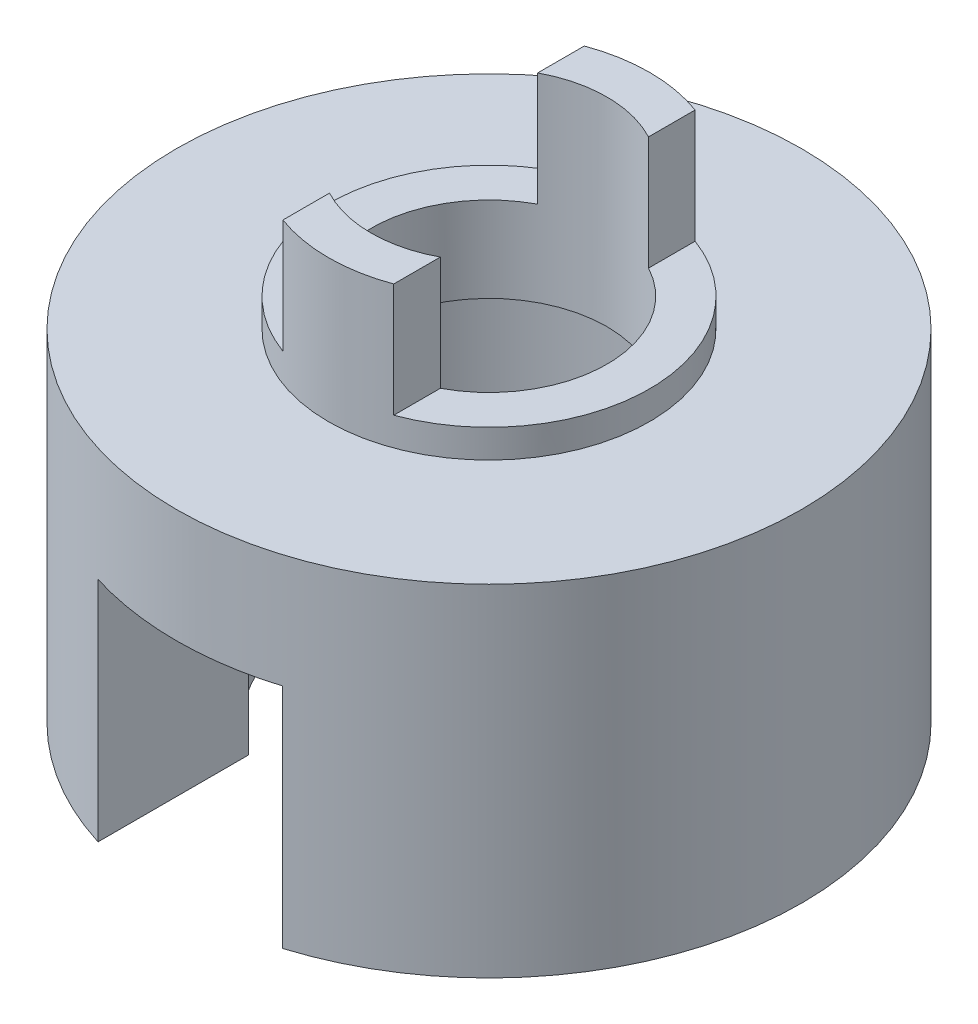
ISO-10303-21;
HEADER;
FILE_DESCRIPTION(('STEP AP214'),'2;1');
FILE_NAME('part.step','',(''),(''),'','','');
FILE_SCHEMA(('AUTOMOTIVE_DESIGN { 1 0 10303 214 1 1 1 1 }'));
ENDSEC;
DATA;
#1=APPLICATION_CONTEXT('core data for automotive mechanical design processes');
#2=APPLICATION_PROTOCOL_DEFINITION('international standard','automotive_design',2000,#1);
#3=PRODUCT_CONTEXT('',#1,'mechanical');
#4=PRODUCT('Part','Part','',(#3));
#5=PRODUCT_RELATED_PRODUCT_CATEGORY('part','',(#4));
#6=PRODUCT_DEFINITION_FORMATION('','',#4);
#7=PRODUCT_DEFINITION_CONTEXT('part definition',#1,'design');
#8=PRODUCT_DEFINITION('design','',#6,#7);
#9=PRODUCT_DEFINITION_SHAPE('','',#8);
#10=(LENGTH_UNIT() NAMED_UNIT(*) SI_UNIT(.MILLI.,.METRE.));
#11=(NAMED_UNIT(*) PLANE_ANGLE_UNIT() SI_UNIT($,.RADIAN.));
#12=(NAMED_UNIT(*) SI_UNIT($,.STERADIAN.) SOLID_ANGLE_UNIT());
#13=UNCERTAINTY_MEASURE_WITH_UNIT(LENGTH_MEASURE(1.E-05),#10,'distance_accuracy_value','');
#14=(GEOMETRIC_REPRESENTATION_CONTEXT(3) GLOBAL_UNCERTAINTY_ASSIGNED_CONTEXT((#13)) GLOBAL_UNIT_ASSIGNED_CONTEXT((#10,
#11,#12)) REPRESENTATION_CONTEXT('',''));
#15=CARTESIAN_POINT('',(0.,0.,0.));
#16=DIRECTION('',(0.,0.,1.));
#17=DIRECTION('',(1.,0.,0.));
#18=AXIS2_PLACEMENT_3D('',#15,#16,#17);
#19=CARTESIAN_POINT('',(0.,-2.,0.));
#20=DIRECTION('',(0.,1.,0.));
#21=DIRECTION('',(0.,0.,1.));
#22=AXIS2_PLACEMENT_3D('',#19,#20,#21);
#23=CYLINDRICAL_SURFACE('',#22,11.);
#24=CARTESIAN_POINT('',(0.,0.,0.));
#25=DIRECTION('',(0.,1.,0.));
#26=DIRECTION('',(0.,0.,1.));
#27=AXIS2_PLACEMENT_3D('',#24,#25,#26);
#28=CIRCLE('',#27,11.);
#29=CARTESIAN_POINT('',(0.,0.,11.));
#30=VERTEX_POINT('',#29);
#31=EDGE_CURVE('E60',#30,#30,#28,.T.);
#32=ORIENTED_EDGE('',*,*,#31,.F.);
#33=EDGE_LOOP('',(#32));
#34=FACE_BOUND('',#33,.T.);
#35=CARTESIAN_POINT('',(0.,-4.,0.));
#36=DIRECTION('',(0.,-1.,0.));
#37=DIRECTION('',(0.,0.,-1.));
#38=AXIS2_PLACEMENT_3D('',#35,#36,#37);
#39=CIRCLE('',#38,11.);
#40=CARTESIAN_POINT('',(3.25,-4.,10.5089247784919));
#41=VERTEX_POINT('',#40);
#42=CARTESIAN_POINT('',(-3.25,-4.,10.5089247784919));
#43=VERTEX_POINT('',#42);
#44=EDGE_CURVE('E180',#41,#43,#39,.T.);
#45=ORIENTED_EDGE('',*,*,#44,.F.);
#46=DIRECTION('',(0.,-1.,0.));
#47=VECTOR('',#46,1.);
#48=CARTESIAN_POINT('',(3.25,-4.,10.5089247784919));
#49=LINE('',#48,#47);
#50=CARTESIAN_POINT('',(3.25,-12.,10.5089247784919));
#51=VERTEX_POINT('',#50);
#52=EDGE_CURVE('E165',#41,#51,#49,.T.);
#53=ORIENTED_EDGE('',*,*,#52,.T.);
#54=CARTESIAN_POINT('',(0.,-12.,0.));
#55=DIRECTION('',(0.,-1.,0.));
#56=DIRECTION('',(0.,0.,-1.));
#57=AXIS2_PLACEMENT_3D('',#54,#55,#56);
#58=CIRCLE('',#57,11.);
#59=CARTESIAN_POINT('',(-10.7121426428143,-12.,-2.5));
#60=VERTEX_POINT('',#59);
#61=EDGE_CURVE('E247',#60,#51,#58,.T.);
#62=ORIENTED_EDGE('',*,*,#61,.F.);
#63=DIRECTION('',(0.,1.,0.));
#64=VECTOR('',#63,1.);
#65=CARTESIAN_POINT('',(-10.7121426428143,-2.,-2.5));
#66=LINE('',#65,#64);
#67=CARTESIAN_POINT('',(-10.7121426428143,-4.,-2.5));
#68=VERTEX_POINT('',#67);
#69=EDGE_CURVE('E231',#68,#60,#66,.F.);
#70=ORIENTED_EDGE('',*,*,#69,.F.);
#71=CARTESIAN_POINT('',(0.,-4.,0.));
#72=DIRECTION('',(0.,1.,0.));
#73=DIRECTION('',(0.,0.,1.));
#74=AXIS2_PLACEMENT_3D('',#71,#72,#73);
#75=CIRCLE('',#74,11.);
#76=CARTESIAN_POINT('',(-10.7121426428143,-4.,2.5));
#77=VERTEX_POINT('',#76);
#78=EDGE_CURVE('E204',#77,#68,#75,.F.);
#79=ORIENTED_EDGE('',*,*,#78,.F.);
#80=DIRECTION('',(0.,1.,0.));
#81=VECTOR('',#80,1.);
#82=CARTESIAN_POINT('',(-10.7121426428143,-2.,2.5));
#83=LINE('',#82,#81);
#84=CARTESIAN_POINT('',(-10.7121426428143,-12.,2.5));
#85=VERTEX_POINT('',#84);
#86=EDGE_CURVE('E234',#77,#85,#83,.F.);
#87=ORIENTED_EDGE('',*,*,#86,.T.);
#88=CARTESIAN_POINT('',(-3.25,-12.,10.5089247784919));
#89=VERTEX_POINT('',#88);
#90=EDGE_CURVE('E250',#89,#85,#58,.T.);
#91=ORIENTED_EDGE('',*,*,#90,.F.);
#92=DIRECTION('',(0.,-1.,0.));
#93=VECTOR('',#92,1.);
#94=CARTESIAN_POINT('',(-3.25,-4.,10.5089247784919));
#95=LINE('',#94,#93);
#96=EDGE_CURVE('E176',#43,#89,#95,.T.);
#97=ORIENTED_EDGE('',*,*,#96,.F.);
#98=EDGE_LOOP('',(#45,#53,#62,#70,#79,#87,#91,#97));
#99=FACE_BOUND('',#98,.T.);
#100=ADVANCED_FACE('F52',(#34,#99),#23,.T.);
#101=CARTESIAN_POINT('',(0.,-12.,0.));
#102=DIRECTION('',(0.,-1.,0.));
#103=DIRECTION('',(0.,0.,-1.));
#104=AXIS2_PLACEMENT_3D('',#101,#102,#103);
#105=PLANE('',#104);
#106=ORIENTED_EDGE('',*,*,#61,.T.);
#107=DIRECTION('',(0.,0.,-1.));
#108=VECTOR('',#107,1.);
#109=CARTESIAN_POINT('',(3.25,-12.,0.));
#110=LINE('',#109,#108);
#111=CARTESIAN_POINT('',(3.25,-12.,5.22111099288264));
#112=VERTEX_POINT('',#111);
#113=EDGE_CURVE('E170',#51,#112,#110,.T.);
#114=ORIENTED_EDGE('',*,*,#113,.T.);
#115=CARTESIAN_POINT('',(0.,-12.,0.));
#116=DIRECTION('',(0.,-1.,0.));
#117=DIRECTION('',(0.,0.,-1.));
#118=AXIS2_PLACEMENT_3D('',#115,#116,#117);
#119=CIRCLE('',#118,6.15);
#120=CARTESIAN_POINT('',(-5.61894118139708,-12.,-2.5));
#121=VERTEX_POINT('',#120);
#122=EDGE_CURVE('E239',#121,#112,#119,.T.);
#123=ORIENTED_EDGE('',*,*,#122,.F.);
#124=DIRECTION('',(1.,0.,0.));
#125=VECTOR('',#124,1.);
#126=CARTESIAN_POINT('',(-11.1812419844062,-12.,-2.5));
#127=LINE('',#126,#125);
#128=EDGE_CURVE('E217',#60,#121,#127,.T.);
#129=ORIENTED_EDGE('',*,*,#128,.F.);
#130=EDGE_LOOP('',(#106,#114,#123,#129));
#131=FACE_BOUND('',#130,.T.);
#132=ADVANCED_FACE('F345',(#131),#105,.T.);
#133=CARTESIAN_POINT('',(-3.25,-12.,5.22111099288264));
#134=VERTEX_POINT('',#133);
#135=CARTESIAN_POINT('',(-5.61894118139708,-12.,2.5));
#136=VERTEX_POINT('',#135);
#137=EDGE_CURVE('E243',#134,#136,#119,.T.);
#138=ORIENTED_EDGE('',*,*,#137,.F.);
#139=DIRECTION('',(0.,0.,1.));
#140=VECTOR('',#139,1.);
#141=CARTESIAN_POINT('',(-3.25,-12.,0.));
#142=LINE('',#141,#140);
#143=EDGE_CURVE('E185',#134,#89,#142,.T.);
#144=ORIENTED_EDGE('',*,*,#143,.T.);
#145=ORIENTED_EDGE('',*,*,#90,.T.);
#146=DIRECTION('',(1.,0.,0.));
#147=VECTOR('',#146,1.);
#148=CARTESIAN_POINT('',(-11.1812419844062,-12.,2.5));
#149=LINE('',#148,#147);
#150=EDGE_CURVE('E197',#85,#136,#149,.T.);
#151=ORIENTED_EDGE('',*,*,#150,.T.);
#152=EDGE_LOOP('',(#138,#144,#145,#151));
#153=FACE_BOUND('',#152,.T.);
#154=ADVANCED_FACE('F350',(#153),#105,.T.);
#155=CARTESIAN_POINT('',(0.,-12.,0.));
#156=DIRECTION('',(0.,1.,0.));
#157=DIRECTION('',(0.,0.,1.));
#158=AXIS2_PLACEMENT_3D('',#155,#156,#157);
#159=CYLINDRICAL_SURFACE('',#158,6.15);
#160=CARTESIAN_POINT('',(0.,-2.,0.));
#161=DIRECTION('',(0.,-1.,0.));
#162=DIRECTION('',(0.,0.,-1.));
#163=AXIS2_PLACEMENT_3D('',#160,#161,#162);
#164=CIRCLE('',#163,6.15);
#165=CARTESIAN_POINT('',(0.,-2.,-6.15));
#166=VERTEX_POINT('',#165);
#167=EDGE_CURVE('E238',#166,#166,#164,.T.);
#168=ORIENTED_EDGE('',*,*,#167,.F.);
#169=EDGE_LOOP('',(#168));
#170=FACE_BOUND('',#169,.T.);
#171=ORIENTED_EDGE('',*,*,#122,.T.);
#172=DIRECTION('',(0.,-1.,0.));
#173=VECTOR('',#172,1.);
#174=CARTESIAN_POINT('',(3.25,-4.,5.22111099288264));
#175=LINE('',#174,#173);
#176=CARTESIAN_POINT('',(3.25,-4.,5.22111099288264));
#177=VERTEX_POINT('',#176);
#178=EDGE_CURVE('E201',#177,#112,#175,.T.);
#179=ORIENTED_EDGE('',*,*,#178,.F.);
#180=CARTESIAN_POINT('',(0.,-4.,0.));
#181=DIRECTION('',(0.,-1.,0.));
#182=DIRECTION('',(0.,0.,-1.));
#183=AXIS2_PLACEMENT_3D('',#180,#181,#182);
#184=CIRCLE('',#183,6.15);
#185=CARTESIAN_POINT('',(-3.25,-4.,5.22111099288264));
#186=VERTEX_POINT('',#185);
#187=EDGE_CURVE('E177',#186,#177,#184,.F.);
#188=ORIENTED_EDGE('',*,*,#187,.F.);
#189=DIRECTION('',(0.,-1.,0.));
#190=VECTOR('',#189,1.);
#191=CARTESIAN_POINT('',(-3.25,-4.,5.22111099288264));
#192=LINE('',#191,#190);
#193=EDGE_CURVE('E205',#186,#134,#192,.T.);
#194=ORIENTED_EDGE('',*,*,#193,.T.);
#195=ORIENTED_EDGE('',*,*,#137,.T.);
#196=DIRECTION('',(0.,-1.,0.));
#197=VECTOR('',#196,1.);
#198=CARTESIAN_POINT('',(-5.61894118139708,-4.,2.5));
#199=LINE('',#198,#197);
#200=CARTESIAN_POINT('',(-5.61894118139708,-4.,2.5));
#201=VERTEX_POINT('',#200);
#202=EDGE_CURVE('E211',#201,#136,#199,.T.);
#203=ORIENTED_EDGE('',*,*,#202,.F.);
#204=CARTESIAN_POINT('',(0.,-4.,0.));
#205=DIRECTION('',(0.,1.,0.));
#206=DIRECTION('',(0.,0.,1.));
#207=AXIS2_PLACEMENT_3D('',#204,#205,#206);
#208=CIRCLE('',#207,6.15);
#209=CARTESIAN_POINT('',(-5.61894118139708,-4.,-2.5));
#210=VERTEX_POINT('',#209);
#211=EDGE_CURVE('E12',#210,#201,#208,.T.);
#212=ORIENTED_EDGE('',*,*,#211,.F.);
#213=DIRECTION('',(0.,-1.,0.));
#214=VECTOR('',#213,1.);
#215=CARTESIAN_POINT('',(-5.61894118139708,-4.,-2.5));
#216=LINE('',#215,#214);
#217=EDGE_CURVE('E75',#210,#121,#216,.T.);
#218=ORIENTED_EDGE('',*,*,#217,.T.);
#219=EDGE_LOOP('',(#171,#179,#188,#194,#195,#203,#212,#218));
#220=FACE_BOUND('',#219,.T.);
#221=ADVANCED_FACE('F356',(#170,#220),#159,.F.);
#222=CARTESIAN_POINT('',(0.,-2.,0.));
#223=DIRECTION('',(0.,1.,0.));
#224=DIRECTION('',(0.,0.,1.));
#225=AXIS2_PLACEMENT_3D('',#222,#223,#224);
#226=PLANE('',#225);
#227=CARTESIAN_POINT('',(0.,-2.,0.));
#228=DIRECTION('',(0.,1.,0.));
#229=DIRECTION('',(0.,0.,1.));
#230=AXIS2_PLACEMENT_3D('',#227,#228,#229);
#231=CIRCLE('',#230,4.15);
#232=CARTESIAN_POINT('',(0.,-2.,4.15));
#233=VERTEX_POINT('',#232);
#234=EDGE_CURVE('E335',#233,#233,#231,.T.);
#235=ORIENTED_EDGE('',*,*,#234,.T.);
#236=EDGE_LOOP('',(#235));
#237=FACE_BOUND('',#236,.T.);
#238=ORIENTED_EDGE('',*,*,#167,.T.);
#239=EDGE_LOOP('',(#238));
#240=FACE_BOUND('',#239,.T.);
#241=ADVANCED_FACE('F399',(#237,#240),#226,.F.);
#242=CARTESIAN_POINT('',(0.,5.,0.));
#243=DIRECTION('',(0.,1.,0.));
#244=DIRECTION('',(0.,0.,1.));
#245=AXIS2_PLACEMENT_3D('',#242,#243,#244);
#246=PLANE('',#245);
#247=DIRECTION('',(0.,0.,1.));
#248=VECTOR('',#247,1.);
#249=CARTESIAN_POINT('',(1.95,5.,3.66333181680284));
#250=LINE('',#249,#248);
#251=CARTESIAN_POINT('',(1.95,5.,3.66333181680284));
#252=VERTEX_POINT('',#251);
#253=CARTESIAN_POINT('',(1.95,5.,5.30282943342514));
#254=VERTEX_POINT('',#253);
#255=EDGE_CURVE('E256',#252,#254,#250,.T.);
#256=ORIENTED_EDGE('',*,*,#255,.F.);
#257=CARTESIAN_POINT('',(0.,5.,0.));
#258=DIRECTION('',(0.,1.,0.));
#259=DIRECTION('',(0.,0.,1.));
#260=AXIS2_PLACEMENT_3D('',#257,#258,#259);
#261=CIRCLE('',#260,4.15);
#262=CARTESIAN_POINT('',(-1.95,5.,3.66333181680284));
#263=VERTEX_POINT('',#262);
#264=EDGE_CURVE('E322',#263,#252,#261,.T.);
#265=ORIENTED_EDGE('',*,*,#264,.F.);
#266=DIRECTION('',(0.,0.,-1.));
#267=VECTOR('',#266,1.);
#268=CARTESIAN_POINT('',(-1.95,5.,3.66333181680284));
#269=LINE('',#268,#267);
#270=CARTESIAN_POINT('',(-1.95,5.,5.30282943342514));
#271=VERTEX_POINT('',#270);
#272=EDGE_CURVE('E305',#271,#263,#269,.T.);
#273=ORIENTED_EDGE('',*,*,#272,.F.);
#274=CARTESIAN_POINT('',(0.,5.,0.));
#275=DIRECTION('',(0.,1.,0.));
#276=DIRECTION('',(0.,0.,1.));
#277=AXIS2_PLACEMENT_3D('',#274,#275,#276);
#278=CIRCLE('',#277,5.65);
#279=EDGE_CURVE('E327',#271,#254,#278,.T.);
#280=ORIENTED_EDGE('',*,*,#279,.T.);
#281=EDGE_LOOP('',(#256,#265,#273,#280));
#282=FACE_BOUND('',#281,.T.);
#283=ADVANCED_FACE('F391',(#282),#246,.T.);
#284=CARTESIAN_POINT('',(0.,0.,0.));
#285=DIRECTION('',(0.,1.,0.));
#286=DIRECTION('',(0.,0.,1.));
#287=AXIS2_PLACEMENT_3D('',#284,#285,#286);
#288=PLANE('',#287);
#289=CARTESIAN_POINT('',(0.,0.,0.));
#290=DIRECTION('',(0.,1.,0.));
#291=DIRECTION('',(0.,0.,1.));
#292=AXIS2_PLACEMENT_3D('',#289,#290,#291);
#293=CIRCLE('',#292,5.65);
#294=CARTESIAN_POINT('',(0.,0.,5.65));
#295=VERTEX_POINT('',#294);
#296=EDGE_CURVE('E278',#295,#295,#293,.T.);
#297=ORIENTED_EDGE('',*,*,#296,.F.);
#298=EDGE_LOOP('',(#297));
#299=FACE_BOUND('',#298,.T.);
#300=ORIENTED_EDGE('',*,*,#31,.T.);
#301=EDGE_LOOP('',(#300));
#302=FACE_BOUND('',#301,.T.);
#303=ADVANCED_FACE('F342',(#299,#302),#288,.T.);
#304=CARTESIAN_POINT('',(0.,-2.,0.));
#305=DIRECTION('',(0.,1.,0.));
#306=DIRECTION('',(0.,0.,1.));
#307=AXIS2_PLACEMENT_3D('',#304,#305,#306);
#308=CYLINDRICAL_SURFACE('',#307,4.15);
#309=ORIENTED_EDGE('',*,*,#264,.T.);
#310=DIRECTION('',(0.,1.,0.));
#311=VECTOR('',#310,1.);
#312=CARTESIAN_POINT('',(1.95,1.,3.66333181680284));
#313=LINE('',#312,#311);
#314=CARTESIAN_POINT('',(1.95,1.,3.66333181680284));
#315=VERTEX_POINT('',#314);
#316=EDGE_CURVE('E279',#315,#252,#313,.T.);
#317=ORIENTED_EDGE('',*,*,#316,.F.);
#318=CARTESIAN_POINT('',(0.,1.,0.));
#319=DIRECTION('',(0.,-1.,0.));
#320=DIRECTION('',(0.,0.,1.));
#321=AXIS2_PLACEMENT_3D('',#318,#319,#320);
#322=CIRCLE('',#321,4.15);
#323=CARTESIAN_POINT('',(1.95,1.,-3.66333181680284));
#324=VERTEX_POINT('',#323);
#325=EDGE_CURVE('E260',#324,#315,#322,.T.);
#326=ORIENTED_EDGE('',*,*,#325,.F.);
#327=DIRECTION('',(0.,1.,0.));
#328=VECTOR('',#327,1.);
#329=CARTESIAN_POINT('',(1.95,1.,-3.66333181680284));
#330=LINE('',#329,#328);
#331=CARTESIAN_POINT('',(1.95,5.,-3.66333181680284));
#332=VERTEX_POINT('',#331);
#333=EDGE_CURVE('E282',#324,#332,#330,.T.);
#334=ORIENTED_EDGE('',*,*,#333,.T.);
#335=CARTESIAN_POINT('',(-1.95,5.,-3.66333181680284));
#336=VERTEX_POINT('',#335);
#337=EDGE_CURVE('E326',#332,#336,#261,.T.);
#338=ORIENTED_EDGE('',*,*,#337,.T.);
#339=DIRECTION('',(0.,1.,0.));
#340=VECTOR('',#339,1.);
#341=CARTESIAN_POINT('',(-1.95,1.,-3.66333181680284));
#342=LINE('',#341,#340);
#343=CARTESIAN_POINT('',(-1.95,1.,-3.66333181680284));
#344=VERTEX_POINT('',#343);
#345=EDGE_CURVE('E313',#344,#336,#342,.T.);
#346=ORIENTED_EDGE('',*,*,#345,.F.);
#347=CARTESIAN_POINT('',(0.,1.,0.));
#348=DIRECTION('',(0.,-1.,0.));
#349=DIRECTION('',(0.,0.,1.));
#350=AXIS2_PLACEMENT_3D('',#347,#348,#349);
#351=CIRCLE('',#350,4.15);
#352=CARTESIAN_POINT('',(-1.95,1.,3.66333181680284));
#353=VERTEX_POINT('',#352);
#354=EDGE_CURVE('E297',#353,#344,#351,.T.);
#355=ORIENTED_EDGE('',*,*,#354,.F.);
#356=DIRECTION('',(0.,1.,0.));
#357=VECTOR('',#356,1.);
#358=CARTESIAN_POINT('',(-1.95,1.,3.66333181680284));
#359=LINE('',#358,#357);
#360=EDGE_CURVE('E316',#353,#263,#359,.T.);
#361=ORIENTED_EDGE('',*,*,#360,.T.);
#362=EDGE_LOOP('',(#309,#317,#326,#334,#338,#346,#355,#361));
#363=FACE_BOUND('',#362,.T.);
#364=ORIENTED_EDGE('',*,*,#234,.F.);
#365=EDGE_LOOP('',(#364));
#366=FACE_BOUND('',#365,.T.);
#367=ADVANCED_FACE('F394',(#363,#366),#308,.F.);
#368=CARTESIAN_POINT('',(0.,5.,0.));
#369=DIRECTION('',(0.,-1.,0.));
#370=DIRECTION('',(0.,0.,-1.));
#371=AXIS2_PLACEMENT_3D('',#368,#369,#370);
#372=CYLINDRICAL_SURFACE('',#371,5.65);
#373=CARTESIAN_POINT('',(0.,1.,0.));
#374=DIRECTION('',(0.,1.,0.));
#375=DIRECTION('',(0.,0.,1.));
#376=AXIS2_PLACEMENT_3D('',#373,#374,#375);
#377=CIRCLE('',#376,5.65);
#378=CARTESIAN_POINT('',(1.95,1.,5.30282943342514));
#379=VERTEX_POINT('',#378);
#380=CARTESIAN_POINT('',(1.95,1.,-5.30282943342514));
#381=VERTEX_POINT('',#380);
#382=EDGE_CURVE('E251',#379,#381,#377,.T.);
#383=ORIENTED_EDGE('',*,*,#382,.F.);
#384=DIRECTION('',(0.,1.,0.));
#385=VECTOR('',#384,1.);
#386=CARTESIAN_POINT('',(1.95,1.,5.30282943342514));
#387=LINE('',#386,#385);
#388=EDGE_CURVE('E274',#379,#254,#387,.T.);
#389=ORIENTED_EDGE('',*,*,#388,.T.);
#390=ORIENTED_EDGE('',*,*,#279,.F.);
#391=DIRECTION('',(0.,1.,0.));
#392=VECTOR('',#391,1.);
#393=CARTESIAN_POINT('',(-1.95,1.,5.30282943342514));
#394=LINE('',#393,#392);
#395=CARTESIAN_POINT('',(-1.95,1.,5.30282943342514));
#396=VERTEX_POINT('',#395);
#397=EDGE_CURVE('E304',#396,#271,#394,.T.);
#398=ORIENTED_EDGE('',*,*,#397,.F.);
#399=CARTESIAN_POINT('',(0.,1.,0.));
#400=DIRECTION('',(0.,1.,0.));
#401=DIRECTION('',(0.,0.,1.));
#402=AXIS2_PLACEMENT_3D('',#399,#400,#401);
#403=CIRCLE('',#402,5.65);
#404=CARTESIAN_POINT('',(-1.95,1.,-5.30282943342514));
#405=VERTEX_POINT('',#404);
#406=EDGE_CURVE('E288',#405,#396,#403,.T.);
#407=ORIENTED_EDGE('',*,*,#406,.F.);
#408=DIRECTION('',(0.,1.,0.));
#409=VECTOR('',#408,1.);
#410=CARTESIAN_POINT('',(-1.95,1.,-5.30282943342514));
#411=LINE('',#410,#409);
#412=CARTESIAN_POINT('',(-1.95,5.,-5.30282943342514));
#413=VERTEX_POINT('',#412);
#414=EDGE_CURVE('E271',#405,#413,#411,.T.);
#415=ORIENTED_EDGE('',*,*,#414,.T.);
#416=CARTESIAN_POINT('',(1.95,5.,-5.30282943342514));
#417=VERTEX_POINT('',#416);
#418=EDGE_CURVE('E331',#417,#413,#278,.T.);
#419=ORIENTED_EDGE('',*,*,#418,.F.);
#420=DIRECTION('',(0.,1.,0.));
#421=VECTOR('',#420,1.);
#422=CARTESIAN_POINT('',(1.95,1.,-5.30282943342514));
#423=LINE('',#422,#421);
#424=EDGE_CURVE('E267',#381,#417,#423,.T.);
#425=ORIENTED_EDGE('',*,*,#424,.F.);
#426=EDGE_LOOP('',(#383,#389,#390,#398,#407,#415,#419,#425));
#427=FACE_BOUND('',#426,.T.);
#428=ORIENTED_EDGE('',*,*,#296,.T.);
#429=EDGE_LOOP('',(#428));
#430=FACE_BOUND('',#429,.T.);
#431=ADVANCED_FACE('F389',(#427,#430),#372,.T.);
#432=DIRECTION('',(0.,0.,1.));
#433=VECTOR('',#432,1.);
#434=CARTESIAN_POINT('',(1.95,5.,-5.30282943342514));
#435=LINE('',#434,#433);
#436=EDGE_CURVE('E268',#417,#332,#435,.T.);
#437=ORIENTED_EDGE('',*,*,#436,.F.);
#438=ORIENTED_EDGE('',*,*,#418,.T.);
#439=DIRECTION('',(0.,0.,-1.));
#440=VECTOR('',#439,1.);
#441=CARTESIAN_POINT('',(-1.95,5.,-5.30282943342514));
#442=LINE('',#441,#440);
#443=EDGE_CURVE('E293',#336,#413,#442,.T.);
#444=ORIENTED_EDGE('',*,*,#443,.F.);
#445=ORIENTED_EDGE('',*,*,#337,.F.);
#446=EDGE_LOOP('',(#437,#438,#444,#445));
#447=FACE_BOUND('',#446,.T.);
#448=ADVANCED_FACE('F382',(#447),#246,.T.);
#449=CARTESIAN_POINT('',(-1.95,1.,-5.30282943342514));
#450=DIRECTION('',(1.,0.,0.));
#451=DIRECTION('',(0.,0.,-1.));
#452=AXIS2_PLACEMENT_3D('',#449,#450,#451);
#453=PLANE('',#452);
#454=ORIENTED_EDGE('',*,*,#443,.T.);
#455=ORIENTED_EDGE('',*,*,#414,.F.);
#456=DIRECTION('',(0.,0.,-1.));
#457=VECTOR('',#456,1.);
#458=CARTESIAN_POINT('',(-1.95,1.,-5.30282943342514));
#459=LINE('',#458,#457);
#460=EDGE_CURVE('E300',#344,#405,#459,.T.);
#461=ORIENTED_EDGE('',*,*,#460,.F.);
#462=ORIENTED_EDGE('',*,*,#345,.T.);
#463=EDGE_LOOP('',(#454,#455,#461,#462));
#464=FACE_BOUND('',#463,.T.);
#465=ADVANCED_FACE('F379',(#464),#453,.F.);
#466=CARTESIAN_POINT('',(-1.95,1.,3.66333181680284));
#467=DIRECTION('',(1.,0.,0.));
#468=DIRECTION('',(0.,0.,-1.));
#469=AXIS2_PLACEMENT_3D('',#466,#467,#468);
#470=PLANE('',#469);
#471=ORIENTED_EDGE('',*,*,#272,.T.);
#472=ORIENTED_EDGE('',*,*,#360,.F.);
#473=DIRECTION('',(0.,0.,-1.));
#474=VECTOR('',#473,1.);
#475=CARTESIAN_POINT('',(-1.95,1.,3.66333181680284));
#476=LINE('',#475,#474);
#477=EDGE_CURVE('E292',#396,#353,#476,.T.);
#478=ORIENTED_EDGE('',*,*,#477,.F.);
#479=ORIENTED_EDGE('',*,*,#397,.T.);
#480=EDGE_LOOP('',(#471,#472,#478,#479));
#481=FACE_BOUND('',#480,.T.);
#482=ADVANCED_FACE('F377',(#481),#470,.F.);
#483=CARTESIAN_POINT('',(0.,1.,0.));
#484=DIRECTION('',(0.,1.,0.));
#485=DIRECTION('',(0.,0.,1.));
#486=AXIS2_PLACEMENT_3D('',#483,#484,#485);
#487=PLANE('',#486);
#488=ORIENTED_EDGE('',*,*,#406,.T.);
#489=ORIENTED_EDGE('',*,*,#477,.T.);
#490=ORIENTED_EDGE('',*,*,#354,.T.);
#491=ORIENTED_EDGE('',*,*,#460,.T.);
#492=EDGE_LOOP('',(#488,#489,#490,#491));
#493=FACE_BOUND('',#492,.T.);
#494=ADVANCED_FACE('F370',(#493),#487,.T.);
#495=CARTESIAN_POINT('',(1.95,1.,3.66333181680284));
#496=DIRECTION('',(-1.,0.,0.));
#497=DIRECTION('',(0.,0.,1.));
#498=AXIS2_PLACEMENT_3D('',#495,#496,#497);
#499=PLANE('',#498);
#500=ORIENTED_EDGE('',*,*,#255,.T.);
#501=ORIENTED_EDGE('',*,*,#388,.F.);
#502=DIRECTION('',(0.,0.,1.));
#503=VECTOR('',#502,1.);
#504=CARTESIAN_POINT('',(1.95,1.,3.66333181680284));
#505=LINE('',#504,#503);
#506=EDGE_CURVE('E263',#315,#379,#505,.T.);
#507=ORIENTED_EDGE('',*,*,#506,.F.);
#508=ORIENTED_EDGE('',*,*,#316,.T.);
#509=EDGE_LOOP('',(#500,#501,#507,#508));
#510=FACE_BOUND('',#509,.T.);
#511=ADVANCED_FACE('F367',(#510),#499,.F.);
#512=CARTESIAN_POINT('',(1.95,1.,-5.30282943342514));
#513=DIRECTION('',(-1.,0.,0.));
#514=DIRECTION('',(0.,0.,1.));
#515=AXIS2_PLACEMENT_3D('',#512,#513,#514);
#516=PLANE('',#515);
#517=ORIENTED_EDGE('',*,*,#436,.T.);
#518=ORIENTED_EDGE('',*,*,#333,.F.);
#519=DIRECTION('',(0.,0.,1.));
#520=VECTOR('',#519,1.);
#521=CARTESIAN_POINT('',(1.95,1.,-5.30282943342514));
#522=LINE('',#521,#520);
#523=EDGE_CURVE('E255',#381,#324,#522,.T.);
#524=ORIENTED_EDGE('',*,*,#523,.F.);
#525=ORIENTED_EDGE('',*,*,#424,.T.);
#526=EDGE_LOOP('',(#517,#518,#524,#525));
#527=FACE_BOUND('',#526,.T.);
#528=ADVANCED_FACE('F365',(#527),#516,.F.);
#529=CARTESIAN_POINT('',(0.,1.,0.));
#530=DIRECTION('',(0.,1.,0.));
#531=DIRECTION('',(0.,0.,1.));
#532=AXIS2_PLACEMENT_3D('',#529,#530,#531);
#533=PLANE('',#532);
#534=ORIENTED_EDGE('',*,*,#382,.T.);
#535=ORIENTED_EDGE('',*,*,#523,.T.);
#536=ORIENTED_EDGE('',*,*,#325,.T.);
#537=ORIENTED_EDGE('',*,*,#506,.T.);
#538=EDGE_LOOP('',(#534,#535,#536,#537));
#539=FACE_BOUND('',#538,.T.);
#540=ADVANCED_FACE('F361',(#539),#533,.T.);
#541=CARTESIAN_POINT('',(-11.1812419844062,-4.,2.5));
#542=DIRECTION('',(0.,0.,-1.));
#543=DIRECTION('',(-1.,0.,0.));
#544=AXIS2_PLACEMENT_3D('',#541,#542,#543);
#545=PLANE('',#544);
#546=DIRECTION('',(1.,0.,0.));
#547=VECTOR('',#546,1.);
#548=CARTESIAN_POINT('',(-11.1812419844062,-4.,2.5));
#549=LINE('',#548,#547);
#550=EDGE_CURVE('E220',#77,#201,#549,.T.);
#551=ORIENTED_EDGE('',*,*,#550,.T.);
#552=ORIENTED_EDGE('',*,*,#202,.T.);
#553=ORIENTED_EDGE('',*,*,#150,.F.);
#554=ORIENTED_EDGE('',*,*,#86,.F.);
#555=EDGE_LOOP('',(#551,#552,#553,#554));
#556=FACE_BOUND('',#555,.T.);
#557=ADVANCED_FACE('F364',(#556),#545,.T.);
#558=CARTESIAN_POINT('',(-11.1812419844062,-4.,-2.5));
#559=DIRECTION('',(0.,0.,-1.));
#560=DIRECTION('',(-1.,0.,0.));
#561=AXIS2_PLACEMENT_3D('',#558,#559,#560);
#562=PLANE('',#561);
#563=ORIENTED_EDGE('',*,*,#69,.T.);
#564=ORIENTED_EDGE('',*,*,#128,.T.);
#565=ORIENTED_EDGE('',*,*,#217,.F.);
#566=DIRECTION('',(1.,0.,0.));
#567=VECTOR('',#566,1.);
#568=CARTESIAN_POINT('',(-11.1812419844062,-4.,-2.5));
#569=LINE('',#568,#567);
#570=EDGE_CURVE('E216',#68,#210,#569,.T.);
#571=ORIENTED_EDGE('',*,*,#570,.F.);
#572=EDGE_LOOP('',(#563,#564,#565,#571));
#573=FACE_BOUND('',#572,.T.);
#574=ADVANCED_FACE('F449',(#573),#562,.F.);
#575=CARTESIAN_POINT('',(0.,-4.,0.));
#576=DIRECTION('',(0.,1.,0.));
#577=DIRECTION('',(0.,0.,1.));
#578=AXIS2_PLACEMENT_3D('',#575,#576,#577);
#579=PLANE('',#578);
#580=ORIENTED_EDGE('',*,*,#78,.T.);
#581=ORIENTED_EDGE('',*,*,#570,.T.);
#582=ORIENTED_EDGE('',*,*,#211,.T.);
#583=ORIENTED_EDGE('',*,*,#550,.F.);
#584=EDGE_LOOP('',(#580,#581,#582,#583));
#585=FACE_BOUND('',#584,.T.);
#586=ADVANCED_FACE('F448',(#585),#579,.F.);
#587=CARTESIAN_POINT('',(3.25,-4.,0.));
#588=DIRECTION('',(-1.,0.,0.));
#589=DIRECTION('',(0.,0.,1.));
#590=AXIS2_PLACEMENT_3D('',#587,#588,#589);
#591=PLANE('',#590);
#592=ORIENTED_EDGE('',*,*,#113,.F.);
#593=ORIENTED_EDGE('',*,*,#52,.F.);
#594=DIRECTION('',(0.,0.,-1.));
#595=VECTOR('',#594,1.);
#596=CARTESIAN_POINT('',(3.25,-4.,0.));
#597=LINE('',#596,#595);
#598=EDGE_CURVE('E168',#41,#177,#597,.T.);
#599=ORIENTED_EDGE('',*,*,#598,.T.);
#600=ORIENTED_EDGE('',*,*,#178,.T.);
#601=EDGE_LOOP('',(#592,#593,#599,#600));
#602=FACE_BOUND('',#601,.T.);
#603=ADVANCED_FACE('F167',(#602),#591,.T.);
#604=CARTESIAN_POINT('',(-3.25,-4.,0.));
#605=DIRECTION('',(1.,0.,0.));
#606=DIRECTION('',(0.,0.,-1.));
#607=AXIS2_PLACEMENT_3D('',#604,#605,#606);
#608=PLANE('',#607);
#609=ORIENTED_EDGE('',*,*,#143,.F.);
#610=ORIENTED_EDGE('',*,*,#193,.F.);
#611=DIRECTION('',(0.,0.,1.));
#612=VECTOR('',#611,1.);
#613=CARTESIAN_POINT('',(-3.25,-4.,0.));
#614=LINE('',#613,#612);
#615=EDGE_CURVE('E67',#186,#43,#614,.T.);
#616=ORIENTED_EDGE('',*,*,#615,.T.);
#617=ORIENTED_EDGE('',*,*,#96,.T.);
#618=EDGE_LOOP('',(#609,#610,#616,#617));
#619=FACE_BOUND('',#618,.T.);
#620=ADVANCED_FACE('F462',(#619),#608,.T.);
#621=CARTESIAN_POINT('',(0.,-4.,0.));
#622=DIRECTION('',(0.,-1.,0.));
#623=DIRECTION('',(0.,0.,-1.));
#624=AXIS2_PLACEMENT_3D('',#621,#622,#623);
#625=PLANE('',#624);
#626=ORIENTED_EDGE('',*,*,#598,.F.);
#627=ORIENTED_EDGE('',*,*,#44,.T.);
#628=ORIENTED_EDGE('',*,*,#615,.F.);
#629=ORIENTED_EDGE('',*,*,#187,.T.);
#630=EDGE_LOOP('',(#626,#627,#628,#629));
#631=FACE_BOUND('',#630,.T.);
#632=ADVANCED_FACE('F179',(#631),#625,.T.);
#633=CLOSED_SHELL('',(#100,#132,#154,#221,#241,#283,#303,#367,#431,#448,#465,#482,#494,#511,
#528,#540,#557,#574,#586,#603,#620,#632));
#634=MANIFOLD_SOLID_BREP('B2',#633);
#635=ADVANCED_BREP_SHAPE_REPRESENTATION('',(#18,#634),#14);
#636=SHAPE_DEFINITION_REPRESENTATION(#9,#635);
ENDSEC;
END-ISO-10303-21;
